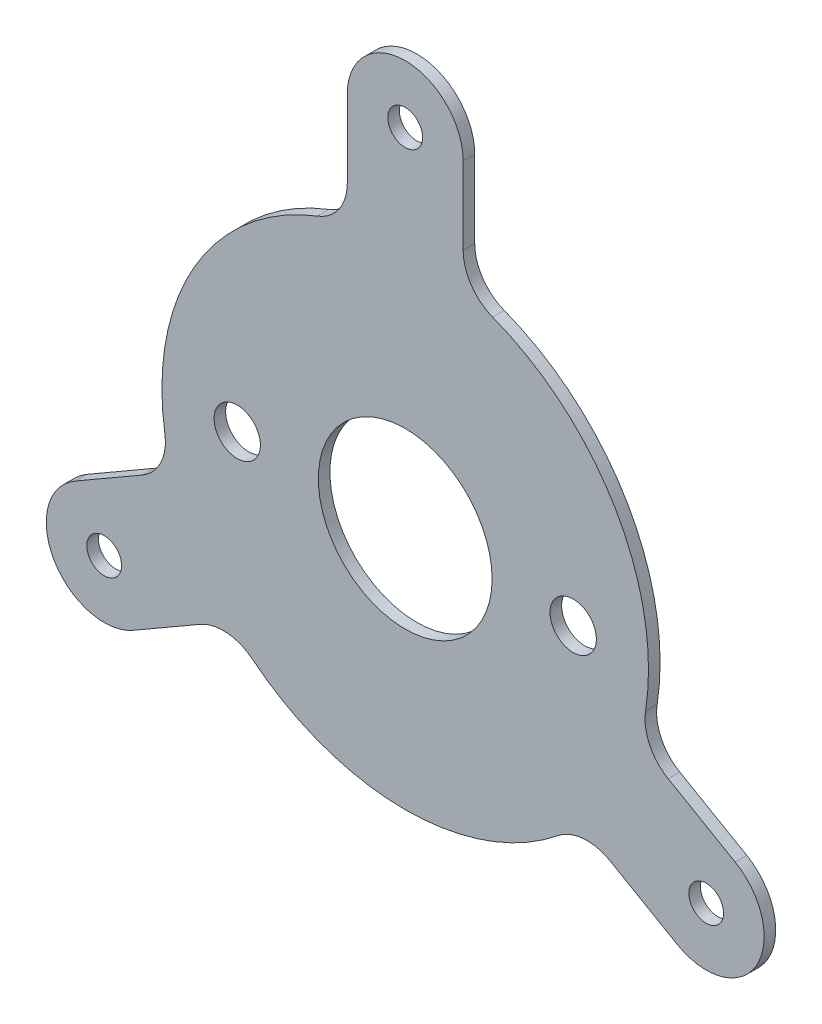
ISO-10303-21;
HEADER;
FILE_DESCRIPTION(('STEP AP214'),'2;1');
FILE_NAME('part.step','',(''),(''),'','','');
FILE_SCHEMA(('AUTOMOTIVE_DESIGN { 1 0 10303 214 1 1 1 1 }'));
ENDSEC;
DATA;
#1=APPLICATION_CONTEXT('core data for automotive mechanical design processes');
#2=APPLICATION_PROTOCOL_DEFINITION('international standard','automotive_design',2000,#1);
#3=PRODUCT_CONTEXT('',#1,'mechanical');
#4=PRODUCT('Part','Part','',(#3));
#5=PRODUCT_RELATED_PRODUCT_CATEGORY('part','',(#4));
#6=PRODUCT_DEFINITION_FORMATION('','',#4);
#7=PRODUCT_DEFINITION_CONTEXT('part definition',#1,'design');
#8=PRODUCT_DEFINITION('design','',#6,#7);
#9=PRODUCT_DEFINITION_SHAPE('','',#8);
#10=(LENGTH_UNIT() NAMED_UNIT(*) SI_UNIT(.MILLI.,.METRE.));
#11=(NAMED_UNIT(*) PLANE_ANGLE_UNIT() SI_UNIT($,.RADIAN.));
#12=(NAMED_UNIT(*) SI_UNIT($,.STERADIAN.) SOLID_ANGLE_UNIT());
#13=UNCERTAINTY_MEASURE_WITH_UNIT(LENGTH_MEASURE(1.E-05),#10,'distance_accuracy_value','');
#14=(GEOMETRIC_REPRESENTATION_CONTEXT(3) GLOBAL_UNCERTAINTY_ASSIGNED_CONTEXT((#13)) GLOBAL_UNIT_ASSIGNED_CONTEXT((#10,
#11,#12)) REPRESENTATION_CONTEXT('',''));
#15=CARTESIAN_POINT('',(0.,0.,0.));
#16=DIRECTION('',(0.,0.,1.));
#17=DIRECTION('',(1.,0.,0.));
#18=AXIS2_PLACEMENT_3D('',#15,#16,#17);
#19=CARTESIAN_POINT('',(0.,30.,1.));
#20=DIRECTION('',(0.,0.,-1.));
#21=DIRECTION('',(-1.,0.,0.));
#22=AXIS2_PLACEMENT_3D('',#19,#20,#21);
#23=PLANE('',#22);
#24=CARTESIAN_POINT('',(0.,30.,1.));
#25=DIRECTION('',(0.,0.,1.));
#26=DIRECTION('',(-1.,0.,0.));
#27=AXIS2_PLACEMENT_3D('',#24,#25,#26);
#28=CIRCLE('',#27,5.);
#29=CARTESIAN_POINT('',(5.,30.,1.));
#30=VERTEX_POINT('',#29);
#31=CARTESIAN_POINT('',(-5.,30.,1.));
#32=VERTEX_POINT('',#31);
#33=EDGE_CURVE('E147',#30,#32,#28,.T.);
#34=ORIENTED_EDGE('',*,*,#33,.T.);
#35=DIRECTION('',(0.,-1.,0.));
#36=VECTOR('',#35,1.);
#37=CARTESIAN_POINT('',(-5.,20.3960780543711,1.));
#38=LINE('',#37,#36);
#39=CARTESIAN_POINT('',(-5.,23.3238075793812,1.));
#40=VERTEX_POINT('',#39);
#41=EDGE_CURVE('E138',#32,#40,#38,.T.);
#42=ORIENTED_EDGE('',*,*,#41,.T.);
#43=CARTESIAN_POINT('',(-9.,23.3238075793812,1.));
#44=DIRECTION('',(0.,0.,-1.));
#45=DIRECTION('',(-1.,0.,0.));
#46=AXIS2_PLACEMENT_3D('',#43,#44,#45);
#47=CIRCLE('',#46,4.);
#48=CARTESIAN_POINT('',(-7.56,19.5919983666802,1.));
#49=VERTEX_POINT('',#48);
#50=EDGE_CURVE('E11',#40,#49,#47,.T.);
#51=ORIENTED_EDGE('',*,*,#50,.T.);
#52=CARTESIAN_POINT('',(0.,0.,1.));
#53=DIRECTION('',(0.,0.,1.));
#54=DIRECTION('',(1.,0.,0.));
#55=AXIS2_PLACEMENT_3D('',#52,#53,#54);
#56=CIRCLE('',#55,21.);
#57=CARTESIAN_POINT('',(-20.7471682964483,-3.24884713072979,1.));
#58=VERTEX_POINT('',#57);
#59=EDGE_CURVE('E146',#49,#58,#56,.T.);
#60=ORIENTED_EDGE('',*,*,#59,.T.);
#61=CARTESIAN_POINT('',(-24.6990098767242,-3.8676751556307,1.));
#62=DIRECTION('',(0.,0.,-1.));
#63=DIRECTION('',(-1.,0.,0.));
#64=AXIS2_PLACEMENT_3D('',#61,#62,#63);
#65=CIRCLE('',#64,4.);
#66=CARTESIAN_POINT('',(-22.6990098767241,-7.33177677076843,1.));
#67=VERTEX_POINT('',#66);
#68=EDGE_CURVE('E215',#58,#67,#65,.T.);
#69=ORIENTED_EDGE('',*,*,#68,.T.);
#70=DIRECTION('',(-0.866025403784431,-0.500000000000013,0.));
#71=VECTOR('',#70,1.);
#72=CARTESIAN_POINT('',(-20.1635217326557,-5.86791200826338,1.));
#73=LINE('',#72,#71);
#74=CARTESIAN_POINT('',(-28.4807621135331,-10.6698729810779,1.));
#75=VERTEX_POINT('',#74);
#76=EDGE_CURVE('E219',#67,#75,#73,.T.);
#77=ORIENTED_EDGE('',*,*,#76,.T.);
#78=CARTESIAN_POINT('',(-25.9807621135331,-15.,1.));
#79=DIRECTION('',(0.,0.,1.));
#80=DIRECTION('',(-1.,0.,0.));
#81=AXIS2_PLACEMENT_3D('',#78,#79,#80);
#82=CIRCLE('',#81,5.);
#83=CARTESIAN_POINT('',(-23.480762113533,-19.3301270189223,1.));
#84=VERTEX_POINT('',#83);
#85=EDGE_CURVE('E229',#75,#84,#82,.T.);
#86=ORIENTED_EDGE('',*,*,#85,.T.);
#87=DIRECTION('',(0.866025403784431,0.500000000000013,0.));
#88=VECTOR('',#87,1.);
#89=CARTESIAN_POINT('',(-15.1635217326557,-14.5281660461078,1.));
#90=LINE('',#89,#88);
#91=CARTESIAN_POINT('',(-17.6990098767242,-15.9920308086129,1.));
#92=VERTEX_POINT('',#91);
#93=EDGE_CURVE('E281',#84,#92,#90,.T.);
#94=ORIENTED_EDGE('',*,*,#93,.T.);
#95=CARTESIAN_POINT('',(-15.6990098767241,-19.4561324237506,1.));
#96=DIRECTION('',(0.,0.,-1.));
#97=DIRECTION('',(-1.,0.,0.));
#98=AXIS2_PLACEMENT_3D('',#95,#96,#97);
#99=CIRCLE('',#98,4.);
#100=CARTESIAN_POINT('',(-13.1871682964483,-16.3431512359505,1.));
#101=VERTEX_POINT('',#100);
#102=EDGE_CURVE('E211',#92,#101,#99,.T.);
#103=ORIENTED_EDGE('',*,*,#102,.T.);
#104=CARTESIAN_POINT('',(0.,0.,1.));
#105=DIRECTION('',(0.,0.,1.));
#106=DIRECTION('',(1.,0.,0.));
#107=AXIS2_PLACEMENT_3D('',#104,#105,#106);
#108=CIRCLE('',#107,21.);
#109=CARTESIAN_POINT('',(13.1871682964483,-16.3431512359505,1.));
#110=VERTEX_POINT('',#109);
#111=EDGE_CURVE('E293',#101,#110,#108,.T.);
#112=ORIENTED_EDGE('',*,*,#111,.T.);
#113=CARTESIAN_POINT('',(15.6990098767241,-19.4561324237506,1.));
#114=DIRECTION('',(0.,0.,-1.));
#115=DIRECTION('',(-1.,0.,0.));
#116=AXIS2_PLACEMENT_3D('',#113,#114,#115);
#117=CIRCLE('',#116,4.);
#118=CARTESIAN_POINT('',(17.6990098767242,-15.9920308086129,1.));
#119=VERTEX_POINT('',#118);
#120=EDGE_CURVE('E207',#110,#119,#117,.T.);
#121=ORIENTED_EDGE('',*,*,#120,.T.);
#122=DIRECTION('',(0.866025403784432,-0.500000000000012,0.));
#123=VECTOR('',#122,1.);
#124=CARTESIAN_POINT('',(15.1635217326557,-14.5281660461078,1.));
#125=LINE('',#124,#123);
#126=CARTESIAN_POINT('',(23.480762113533,-19.3301270189223,1.));
#127=VERTEX_POINT('',#126);
#128=EDGE_CURVE('E295',#119,#127,#125,.T.);
#129=ORIENTED_EDGE('',*,*,#128,.T.);
#130=CARTESIAN_POINT('',(25.9807621135331,-15.,1.));
#131=DIRECTION('',(0.,0.,1.));
#132=DIRECTION('',(-1.,0.,0.));
#133=AXIS2_PLACEMENT_3D('',#130,#131,#132);
#134=CIRCLE('',#133,5.);
#135=CARTESIAN_POINT('',(28.4807621135331,-10.6698729810779,1.));
#136=VERTEX_POINT('',#135);
#137=EDGE_CURVE('E297',#127,#136,#134,.T.);
#138=ORIENTED_EDGE('',*,*,#137,.T.);
#139=DIRECTION('',(-0.866025403784432,0.500000000000012,0.));
#140=VECTOR('',#139,1.);
#141=CARTESIAN_POINT('',(20.1635217326557,-5.86791200826338,1.));
#142=LINE('',#141,#140);
#143=CARTESIAN_POINT('',(22.6990098767241,-7.33177677076843,1.));
#144=VERTEX_POINT('',#143);
#145=EDGE_CURVE('E303',#136,#144,#142,.T.);
#146=ORIENTED_EDGE('',*,*,#145,.T.);
#147=CARTESIAN_POINT('',(24.6990098767242,-3.8676751556307,1.));
#148=DIRECTION('',(0.,0.,-1.));
#149=DIRECTION('',(-1.,0.,0.));
#150=AXIS2_PLACEMENT_3D('',#147,#148,#149);
#151=CIRCLE('',#150,4.);
#152=CARTESIAN_POINT('',(20.7471682964483,-3.24884713072979,1.));
#153=VERTEX_POINT('',#152);
#154=EDGE_CURVE('E203',#144,#153,#151,.T.);
#155=ORIENTED_EDGE('',*,*,#154,.T.);
#156=CARTESIAN_POINT('',(0.,0.,1.));
#157=DIRECTION('',(0.,0.,1.));
#158=DIRECTION('',(1.,0.,0.));
#159=AXIS2_PLACEMENT_3D('',#156,#157,#158);
#160=CIRCLE('',#159,21.);
#161=CARTESIAN_POINT('',(7.56,19.5919983666802,1.));
#162=VERTEX_POINT('',#161);
#163=EDGE_CURVE('E306',#153,#162,#160,.T.);
#164=ORIENTED_EDGE('',*,*,#163,.T.);
#165=CARTESIAN_POINT('',(9.,23.3238075793812,1.));
#166=DIRECTION('',(0.,0.,-1.));
#167=DIRECTION('',(-1.,0.,0.));
#168=AXIS2_PLACEMENT_3D('',#165,#166,#167);
#169=CIRCLE('',#168,4.);
#170=CARTESIAN_POINT('',(5.,23.3238075793812,1.));
#171=VERTEX_POINT('',#170);
#172=EDGE_CURVE('E199',#162,#171,#169,.T.);
#173=ORIENTED_EDGE('',*,*,#172,.T.);
#174=DIRECTION('',(0.,1.,0.));
#175=VECTOR('',#174,1.);
#176=CARTESIAN_POINT('',(5.,20.3960780543711,1.));
#177=LINE('',#176,#175);
#178=EDGE_CURVE('E152',#171,#30,#177,.T.);
#179=ORIENTED_EDGE('',*,*,#178,.T.);
#180=EDGE_LOOP('',(#34,#42,#51,#60,#69,#77,#86,#94,#103,#112,#121,#129,#138,#146,#155,#164,#173,#179));
#181=FACE_BOUND('',#180,.T.);
#182=CARTESIAN_POINT('',(0.,30.,1.));
#183=DIRECTION('',(0.,0.,1.));
#184=DIRECTION('',(1.,0.,0.));
#185=AXIS2_PLACEMENT_3D('',#182,#183,#184);
#186=CIRCLE('',#185,1.5);
#187=CARTESIAN_POINT('',(1.5,30.,1.));
#188=VERTEX_POINT('',#187);
#189=EDGE_CURVE('E309',#188,#188,#186,.T.);
#190=ORIENTED_EDGE('',*,*,#189,.F.);
#191=EDGE_LOOP('',(#190));
#192=FACE_BOUND('',#191,.T.);
#193=CARTESIAN_POINT('',(25.9807621135331,-15.,1.));
#194=DIRECTION('',(0.,0.,1.));
#195=DIRECTION('',(1.,0.,0.));
#196=AXIS2_PLACEMENT_3D('',#193,#194,#195);
#197=CIRCLE('',#196,1.5);
#198=CARTESIAN_POINT('',(27.4807621135331,-15.,1.));
#199=VERTEX_POINT('',#198);
#200=EDGE_CURVE('E316',#199,#199,#197,.T.);
#201=ORIENTED_EDGE('',*,*,#200,.F.);
#202=EDGE_LOOP('',(#201));
#203=FACE_BOUND('',#202,.T.);
#204=CARTESIAN_POINT('',(-25.9807621135331,-15.,1.));
#205=DIRECTION('',(0.,0.,1.));
#206=DIRECTION('',(1.,0.,0.));
#207=AXIS2_PLACEMENT_3D('',#204,#205,#206);
#208=CIRCLE('',#207,1.5);
#209=CARTESIAN_POINT('',(-24.4807621135331,-15.,1.));
#210=VERTEX_POINT('',#209);
#211=EDGE_CURVE('E608',#210,#210,#208,.T.);
#212=ORIENTED_EDGE('',*,*,#211,.F.);
#213=EDGE_LOOP('',(#212));
#214=FACE_BOUND('',#213,.T.);
#215=CARTESIAN_POINT('',(0.,0.,1.));
#216=DIRECTION('',(0.,0.,1.));
#217=DIRECTION('',(1.,0.,0.));
#218=AXIS2_PLACEMENT_3D('',#215,#216,#217);
#219=CIRCLE('',#218,7.5);
#220=CARTESIAN_POINT('',(7.5,0.,1.));
#221=VERTEX_POINT('',#220);
#222=EDGE_CURVE('E602',#221,#221,#219,.T.);
#223=ORIENTED_EDGE('',*,*,#222,.F.);
#224=EDGE_LOOP('',(#223));
#225=FACE_BOUND('',#224,.T.);
#226=CARTESIAN_POINT('',(14.5,0.,1.));
#227=DIRECTION('',(0.,0.,1.));
#228=DIRECTION('',(1.,0.,0.));
#229=AXIS2_PLACEMENT_3D('',#226,#227,#228);
#230=CIRCLE('',#229,2.);
#231=CARTESIAN_POINT('',(16.5,0.,1.));
#232=VERTEX_POINT('',#231);
#233=EDGE_CURVE('E596',#232,#232,#230,.T.);
#234=ORIENTED_EDGE('',*,*,#233,.F.);
#235=EDGE_LOOP('',(#234));
#236=FACE_BOUND('',#235,.T.);
#237=CARTESIAN_POINT('',(-14.5,0.,1.));
#238=DIRECTION('',(0.,0.,1.));
#239=DIRECTION('',(1.,0.,0.));
#240=AXIS2_PLACEMENT_3D('',#237,#238,#239);
#241=CIRCLE('',#240,2.);
#242=CARTESIAN_POINT('',(-12.5,0.,1.));
#243=VERTEX_POINT('',#242);
#244=EDGE_CURVE('E587',#243,#243,#241,.T.);
#245=ORIENTED_EDGE('',*,*,#244,.F.);
#246=EDGE_LOOP('',(#245));
#247=FACE_BOUND('',#246,.T.);
#248=ADVANCED_FACE('F17',(#181,#192,#203,#214,#225,#236,#247),#23,.F.);
#249=CARTESIAN_POINT('',(0.,30.,0.));
#250=DIRECTION('',(0.,0.,-1.));
#251=DIRECTION('',(-1.,0.,0.));
#252=AXIS2_PLACEMENT_3D('',#249,#250,#251);
#253=PLANE('',#252);
#254=CARTESIAN_POINT('',(14.5,0.,0.));
#255=DIRECTION('',(0.,0.,1.));
#256=DIRECTION('',(1.,0.,0.));
#257=AXIS2_PLACEMENT_3D('',#254,#255,#256);
#258=CIRCLE('',#257,2.);
#259=CARTESIAN_POINT('',(16.5,0.,0.));
#260=VERTEX_POINT('',#259);
#261=EDGE_CURVE('E593',#260,#260,#258,.T.);
#262=ORIENTED_EDGE('',*,*,#261,.T.);
#263=EDGE_LOOP('',(#262));
#264=FACE_BOUND('',#263,.T.);
#265=CARTESIAN_POINT('',(-25.9807621135331,-15.,0.));
#266=DIRECTION('',(0.,0.,1.));
#267=DIRECTION('',(1.,0.,0.));
#268=AXIS2_PLACEMENT_3D('',#265,#266,#267);
#269=CIRCLE('',#268,1.5);
#270=CARTESIAN_POINT('',(-24.4807621135331,-15.,0.));
#271=VERTEX_POINT('',#270);
#272=EDGE_CURVE('E605',#271,#271,#269,.T.);
#273=ORIENTED_EDGE('',*,*,#272,.T.);
#274=EDGE_LOOP('',(#273));
#275=FACE_BOUND('',#274,.T.);
#276=CARTESIAN_POINT('',(0.,30.,0.));
#277=DIRECTION('',(0.,0.,1.));
#278=DIRECTION('',(1.,0.,0.));
#279=AXIS2_PLACEMENT_3D('',#276,#277,#278);
#280=CIRCLE('',#279,1.5);
#281=CARTESIAN_POINT('',(1.5,30.,0.));
#282=VERTEX_POINT('',#281);
#283=EDGE_CURVE('E311',#282,#282,#280,.T.);
#284=ORIENTED_EDGE('',*,*,#283,.T.);
#285=EDGE_LOOP('',(#284));
#286=FACE_BOUND('',#285,.T.);
#287=CARTESIAN_POINT('',(0.,30.,0.));
#288=DIRECTION('',(0.,0.,1.));
#289=DIRECTION('',(-1.,0.,0.));
#290=AXIS2_PLACEMENT_3D('',#287,#288,#289);
#291=CIRCLE('',#290,5.);
#292=CARTESIAN_POINT('',(5.,30.,0.));
#293=VERTEX_POINT('',#292);
#294=CARTESIAN_POINT('',(-5.,30.,0.));
#295=VERTEX_POINT('',#294);
#296=EDGE_CURVE('E160',#293,#295,#291,.T.);
#297=ORIENTED_EDGE('',*,*,#296,.F.);
#298=DIRECTION('',(0.,1.,0.));
#299=VECTOR('',#298,1.);
#300=CARTESIAN_POINT('',(5.,20.3960780543711,0.));
#301=LINE('',#300,#299);
#302=CARTESIAN_POINT('',(5.,23.3238075793812,0.));
#303=VERTEX_POINT('',#302);
#304=EDGE_CURVE('E156',#303,#293,#301,.T.);
#305=ORIENTED_EDGE('',*,*,#304,.F.);
#306=CARTESIAN_POINT('',(9.,23.3238075793812,0.));
#307=DIRECTION('',(0.,0.,-1.));
#308=DIRECTION('',(-1.,0.,0.));
#309=AXIS2_PLACEMENT_3D('',#306,#307,#308);
#310=CIRCLE('',#309,4.);
#311=CARTESIAN_POINT('',(7.56,19.5919983666802,0.));
#312=VERTEX_POINT('',#311);
#313=EDGE_CURVE('E197',#303,#312,#310,.F.);
#314=ORIENTED_EDGE('',*,*,#313,.T.);
#315=CARTESIAN_POINT('',(0.,0.,0.));
#316=DIRECTION('',(0.,0.,1.));
#317=DIRECTION('',(1.,0.,0.));
#318=AXIS2_PLACEMENT_3D('',#315,#316,#317);
#319=CIRCLE('',#318,21.);
#320=CARTESIAN_POINT('',(20.7471682964483,-3.24884713072979,0.));
#321=VERTEX_POINT('',#320);
#322=EDGE_CURVE('E262',#321,#312,#319,.T.);
#323=ORIENTED_EDGE('',*,*,#322,.F.);
#324=CARTESIAN_POINT('',(24.6990098767242,-3.8676751556307,0.));
#325=DIRECTION('',(0.,0.,-1.));
#326=DIRECTION('',(-1.,0.,0.));
#327=AXIS2_PLACEMENT_3D('',#324,#325,#326);
#328=CIRCLE('',#327,4.);
#329=CARTESIAN_POINT('',(22.6990098767241,-7.33177677076843,0.));
#330=VERTEX_POINT('',#329);
#331=EDGE_CURVE('E201',#321,#330,#328,.F.);
#332=ORIENTED_EDGE('',*,*,#331,.T.);
#333=DIRECTION('',(-0.866025403784432,0.500000000000012,0.));
#334=VECTOR('',#333,1.);
#335=CARTESIAN_POINT('',(20.1635217326557,-5.86791200826338,0.));
#336=LINE('',#335,#334);
#337=CARTESIAN_POINT('',(28.4807621135331,-10.6698729810779,0.));
#338=VERTEX_POINT('',#337);
#339=EDGE_CURVE('E259',#338,#330,#336,.T.);
#340=ORIENTED_EDGE('',*,*,#339,.F.);
#341=CARTESIAN_POINT('',(25.9807621135331,-15.,0.));
#342=DIRECTION('',(0.,0.,1.));
#343=DIRECTION('',(-1.,0.,0.));
#344=AXIS2_PLACEMENT_3D('',#341,#342,#343);
#345=CIRCLE('',#344,5.);
#346=CARTESIAN_POINT('',(23.480762113533,-19.3301270189223,0.));
#347=VERTEX_POINT('',#346);
#348=EDGE_CURVE('E257',#347,#338,#345,.T.);
#349=ORIENTED_EDGE('',*,*,#348,.F.);
#350=DIRECTION('',(0.866025403784432,-0.500000000000012,0.));
#351=VECTOR('',#350,1.);
#352=CARTESIAN_POINT('',(15.1635217326557,-14.5281660461078,0.));
#353=LINE('',#352,#351);
#354=CARTESIAN_POINT('',(17.6990098767242,-15.9920308086129,0.));
#355=VERTEX_POINT('',#354);
#356=EDGE_CURVE('E255',#355,#347,#353,.T.);
#357=ORIENTED_EDGE('',*,*,#356,.F.);
#358=CARTESIAN_POINT('',(15.6990098767241,-19.4561324237506,0.));
#359=DIRECTION('',(0.,0.,-1.));
#360=DIRECTION('',(-1.,0.,0.));
#361=AXIS2_PLACEMENT_3D('',#358,#359,#360);
#362=CIRCLE('',#361,4.);
#363=CARTESIAN_POINT('',(13.1871682964483,-16.3431512359505,0.));
#364=VERTEX_POINT('',#363);
#365=EDGE_CURVE('E205',#355,#364,#362,.F.);
#366=ORIENTED_EDGE('',*,*,#365,.T.);
#367=CARTESIAN_POINT('',(0.,0.,0.));
#368=DIRECTION('',(0.,0.,1.));
#369=DIRECTION('',(1.,0.,0.));
#370=AXIS2_PLACEMENT_3D('',#367,#368,#369);
#371=CIRCLE('',#370,21.);
#372=CARTESIAN_POINT('',(-13.1871682964483,-16.3431512359505,0.));
#373=VERTEX_POINT('',#372);
#374=EDGE_CURVE('E252',#373,#364,#371,.T.);
#375=ORIENTED_EDGE('',*,*,#374,.F.);
#376=CARTESIAN_POINT('',(-15.6990098767241,-19.4561324237506,0.));
#377=DIRECTION('',(0.,0.,-1.));
#378=DIRECTION('',(-1.,0.,0.));
#379=AXIS2_PLACEMENT_3D('',#376,#377,#378);
#380=CIRCLE('',#379,4.);
#381=CARTESIAN_POINT('',(-17.6990098767242,-15.9920308086129,0.));
#382=VERTEX_POINT('',#381);
#383=EDGE_CURVE('E209',#373,#382,#380,.F.);
#384=ORIENTED_EDGE('',*,*,#383,.T.);
#385=DIRECTION('',(0.866025403784431,0.500000000000013,0.));
#386=VECTOR('',#385,1.);
#387=CARTESIAN_POINT('',(-15.1635217326557,-14.5281660461078,0.));
#388=LINE('',#387,#386);
#389=CARTESIAN_POINT('',(-23.480762113533,-19.3301270189223,0.));
#390=VERTEX_POINT('',#389);
#391=EDGE_CURVE('E249',#390,#382,#388,.T.);
#392=ORIENTED_EDGE('',*,*,#391,.F.);
#393=CARTESIAN_POINT('',(-25.9807621135331,-15.,0.));
#394=DIRECTION('',(0.,0.,1.));
#395=DIRECTION('',(-1.,0.,0.));
#396=AXIS2_PLACEMENT_3D('',#393,#394,#395);
#397=CIRCLE('',#396,5.);
#398=CARTESIAN_POINT('',(-28.4807621135331,-10.6698729810779,0.));
#399=VERTEX_POINT('',#398);
#400=EDGE_CURVE('E243',#399,#390,#397,.T.);
#401=ORIENTED_EDGE('',*,*,#400,.F.);
#402=DIRECTION('',(-0.866025403784431,-0.500000000000013,0.));
#403=VECTOR('',#402,1.);
#404=CARTESIAN_POINT('',(-20.1635217326557,-5.86791200826338,0.));
#405=LINE('',#404,#403);
#406=CARTESIAN_POINT('',(-22.6990098767241,-7.33177677076843,0.));
#407=VERTEX_POINT('',#406);
#408=EDGE_CURVE('E237',#407,#399,#405,.T.);
#409=ORIENTED_EDGE('',*,*,#408,.F.);
#410=CARTESIAN_POINT('',(-24.6990098767242,-3.8676751556307,0.));
#411=DIRECTION('',(0.,0.,-1.));
#412=DIRECTION('',(-1.,0.,0.));
#413=AXIS2_PLACEMENT_3D('',#410,#411,#412);
#414=CIRCLE('',#413,4.);
#415=CARTESIAN_POINT('',(-20.7471682964483,-3.24884713072979,0.));
#416=VERTEX_POINT('',#415);
#417=EDGE_CURVE('E213',#407,#416,#414,.F.);
#418=ORIENTED_EDGE('',*,*,#417,.T.);
#419=CARTESIAN_POINT('',(0.,0.,0.));
#420=DIRECTION('',(0.,0.,1.));
#421=DIRECTION('',(1.,0.,0.));
#422=AXIS2_PLACEMENT_3D('',#419,#420,#421);
#423=CIRCLE('',#422,21.);
#424=CARTESIAN_POINT('',(-7.56,19.5919983666802,0.));
#425=VERTEX_POINT('',#424);
#426=EDGE_CURVE('E235',#425,#416,#423,.T.);
#427=ORIENTED_EDGE('',*,*,#426,.F.);
#428=CARTESIAN_POINT('',(-9.,23.3238075793812,0.));
#429=DIRECTION('',(0.,0.,-1.));
#430=DIRECTION('',(-1.,0.,0.));
#431=AXIS2_PLACEMENT_3D('',#428,#429,#430);
#432=CIRCLE('',#431,4.);
#433=CARTESIAN_POINT('',(-5.,23.3238075793812,0.));
#434=VERTEX_POINT('',#433);
#435=EDGE_CURVE('E25',#425,#434,#432,.F.);
#436=ORIENTED_EDGE('',*,*,#435,.T.);
#437=DIRECTION('',(0.,-1.,0.));
#438=VECTOR('',#437,1.);
#439=CARTESIAN_POINT('',(-5.,20.3960780543711,0.));
#440=LINE('',#439,#438);
#441=EDGE_CURVE('E241',#295,#434,#440,.T.);
#442=ORIENTED_EDGE('',*,*,#441,.F.);
#443=EDGE_LOOP('',(#297,#305,#314,#323,#332,#340,#349,#357,#366,#375,#384,#392,#401,#409,#418,
#427,#436,#442));
#444=FACE_BOUND('',#443,.T.);
#445=CARTESIAN_POINT('',(25.9807621135331,-15.,0.));
#446=DIRECTION('',(0.,0.,1.));
#447=DIRECTION('',(1.,0.,0.));
#448=AXIS2_PLACEMENT_3D('',#445,#446,#447);
#449=CIRCLE('',#448,1.5);
#450=CARTESIAN_POINT('',(27.4807621135331,-15.,0.));
#451=VERTEX_POINT('',#450);
#452=EDGE_CURVE('E319',#451,#451,#449,.T.);
#453=ORIENTED_EDGE('',*,*,#452,.T.);
#454=EDGE_LOOP('',(#453));
#455=FACE_BOUND('',#454,.T.);
#456=CARTESIAN_POINT('',(0.,0.,0.));
#457=DIRECTION('',(0.,0.,1.));
#458=DIRECTION('',(1.,0.,0.));
#459=AXIS2_PLACEMENT_3D('',#456,#457,#458);
#460=CIRCLE('',#459,7.5);
#461=CARTESIAN_POINT('',(7.5,0.,0.));
#462=VERTEX_POINT('',#461);
#463=EDGE_CURVE('E599',#462,#462,#460,.T.);
#464=ORIENTED_EDGE('',*,*,#463,.T.);
#465=EDGE_LOOP('',(#464));
#466=FACE_BOUND('',#465,.T.);
#467=CARTESIAN_POINT('',(-14.5,0.,0.));
#468=DIRECTION('',(0.,0.,1.));
#469=DIRECTION('',(1.,0.,0.));
#470=AXIS2_PLACEMENT_3D('',#467,#468,#469);
#471=CIRCLE('',#470,2.);
#472=CARTESIAN_POINT('',(-12.5,0.,0.));
#473=VERTEX_POINT('',#472);
#474=EDGE_CURVE('E590',#473,#473,#471,.T.);
#475=ORIENTED_EDGE('',*,*,#474,.T.);
#476=EDGE_LOOP('',(#475));
#477=FACE_BOUND('',#476,.T.);
#478=ADVANCED_FACE('F233',(#264,#275,#286,#444,#455,#466,#477),#253,.T.);
#479=CARTESIAN_POINT('',(0.,30.,1.));
#480=DIRECTION('',(0.,0.,-1.));
#481=DIRECTION('',(-1.,0.,0.));
#482=AXIS2_PLACEMENT_3D('',#479,#480,#481);
#483=CYLINDRICAL_SURFACE('',#482,5.);
#484=ORIENTED_EDGE('',*,*,#296,.T.);
#485=DIRECTION('',(0.,0.,-1.));
#486=VECTOR('',#485,1.);
#487=CARTESIAN_POINT('',(-5.,30.,1.));
#488=LINE('',#487,#486);
#489=EDGE_CURVE('E142',#32,#295,#488,.T.);
#490=ORIENTED_EDGE('',*,*,#489,.F.);
#491=ORIENTED_EDGE('',*,*,#33,.F.);
#492=DIRECTION('',(0.,0.,-1.));
#493=VECTOR('',#492,1.);
#494=CARTESIAN_POINT('',(5.,30.,1.));
#495=LINE('',#494,#493);
#496=EDGE_CURVE('E266',#30,#293,#495,.T.);
#497=ORIENTED_EDGE('',*,*,#496,.T.);
#498=EDGE_LOOP('',(#484,#490,#491,#497));
#499=FACE_BOUND('',#498,.T.);
#500=ADVANCED_FACE('F158',(#499),#483,.T.);
#501=CARTESIAN_POINT('',(-5.,20.3960780543711,1.));
#502=DIRECTION('',(1.,0.,0.));
#503=DIRECTION('',(0.,0.,-1.));
#504=AXIS2_PLACEMENT_3D('',#501,#502,#503);
#505=PLANE('',#504);
#506=ORIENTED_EDGE('',*,*,#441,.T.);
#507=DIRECTION('',(0.,0.,1.));
#508=VECTOR('',#507,1.);
#509=CARTESIAN_POINT('',(-5.,23.3238075793812,1.));
#510=LINE('',#509,#508);
#511=EDGE_CURVE('E32',#434,#40,#510,.T.);
#512=ORIENTED_EDGE('',*,*,#511,.T.);
#513=ORIENTED_EDGE('',*,*,#41,.F.);
#514=ORIENTED_EDGE('',*,*,#489,.T.);
#515=EDGE_LOOP('',(#506,#512,#513,#514));
#516=FACE_BOUND('',#515,.T.);
#517=ADVANCED_FACE('F140',(#516),#505,.F.);
#518=CARTESIAN_POINT('',(0.,0.,1.));
#519=DIRECTION('',(0.,0.,-1.));
#520=DIRECTION('',(-1.,0.,0.));
#521=AXIS2_PLACEMENT_3D('',#518,#519,#520);
#522=CYLINDRICAL_SURFACE('',#521,21.);
#523=ORIENTED_EDGE('',*,*,#426,.T.);
#524=DIRECTION('',(0.,0.,-1.));
#525=VECTOR('',#524,1.);
#526=CARTESIAN_POINT('',(-20.7471682964483,-3.24884713072979,1.));
#527=LINE('',#526,#525);
#528=EDGE_CURVE('E194',#416,#58,#527,.F.);
#529=ORIENTED_EDGE('',*,*,#528,.T.);
#530=ORIENTED_EDGE('',*,*,#59,.F.);
#531=DIRECTION('',(0.,0.,-1.));
#532=VECTOR('',#531,1.);
#533=CARTESIAN_POINT('',(-7.56,19.5919983666802,1.));
#534=LINE('',#533,#532);
#535=EDGE_CURVE('E191',#49,#425,#534,.T.);
#536=ORIENTED_EDGE('',*,*,#535,.T.);
#537=EDGE_LOOP('',(#523,#529,#530,#536));
#538=FACE_BOUND('',#537,.T.);
#539=ADVANCED_FACE('F239',(#538),#522,.T.);
#540=CARTESIAN_POINT('',(-20.1635217326557,-5.86791200826338,1.));
#541=DIRECTION('',(0.500000000000013,-0.866025403784431,0.));
#542=DIRECTION('',(0.866025403784431,0.500000000000013,0.));
#543=AXIS2_PLACEMENT_3D('',#540,#541,#542);
#544=PLANE('',#543);
#545=ORIENTED_EDGE('',*,*,#76,.F.);
#546=DIRECTION('',(0.,0.,1.));
#547=VECTOR('',#546,1.);
#548=CARTESIAN_POINT('',(-22.6990098767241,-7.33177677076843,0.));
#549=LINE('',#548,#547);
#550=EDGE_CURVE('E188',#67,#407,#549,.F.);
#551=ORIENTED_EDGE('',*,*,#550,.T.);
#552=ORIENTED_EDGE('',*,*,#408,.T.);
#553=DIRECTION('',(0.,0.,-1.));
#554=VECTOR('',#553,1.);
#555=CARTESIAN_POINT('',(-28.4807621135331,-10.6698729810779,1.));
#556=LINE('',#555,#554);
#557=EDGE_CURVE('E162',#75,#399,#556,.T.);
#558=ORIENTED_EDGE('',*,*,#557,.F.);
#559=EDGE_LOOP('',(#545,#551,#552,#558));
#560=FACE_BOUND('',#559,.T.);
#561=ADVANCED_FACE('F226',(#560),#544,.F.);
#562=CARTESIAN_POINT('',(-25.9807621135331,-15.,1.));
#563=DIRECTION('',(0.,0.,-1.));
#564=DIRECTION('',(-1.,0.,0.));
#565=AXIS2_PLACEMENT_3D('',#562,#563,#564);
#566=CYLINDRICAL_SURFACE('',#565,5.);
#567=ORIENTED_EDGE('',*,*,#400,.T.);
#568=DIRECTION('',(0.,0.,-1.));
#569=VECTOR('',#568,1.);
#570=CARTESIAN_POINT('',(-23.480762113533,-19.3301270189223,1.));
#571=LINE('',#570,#569);
#572=EDGE_CURVE('E168',#84,#390,#571,.T.);
#573=ORIENTED_EDGE('',*,*,#572,.F.);
#574=ORIENTED_EDGE('',*,*,#85,.F.);
#575=ORIENTED_EDGE('',*,*,#557,.T.);
#576=EDGE_LOOP('',(#567,#573,#574,#575));
#577=FACE_BOUND('',#576,.T.);
#578=ADVANCED_FACE('F322',(#577),#566,.T.);
#579=CARTESIAN_POINT('',(-15.1635217326557,-14.5281660461078,1.));
#580=DIRECTION('',(-0.500000000000013,0.866025403784431,0.));
#581=DIRECTION('',(-0.866025403784431,-0.500000000000013,0.));
#582=AXIS2_PLACEMENT_3D('',#579,#580,#581);
#583=PLANE('',#582);
#584=ORIENTED_EDGE('',*,*,#391,.T.);
#585=DIRECTION('',(0.,0.,1.));
#586=VECTOR('',#585,1.);
#587=CARTESIAN_POINT('',(-17.6990098767242,-15.9920308086129,1.));
#588=LINE('',#587,#586);
#589=EDGE_CURVE('E186',#382,#92,#588,.T.);
#590=ORIENTED_EDGE('',*,*,#589,.T.);
#591=ORIENTED_EDGE('',*,*,#93,.F.);
#592=ORIENTED_EDGE('',*,*,#572,.T.);
#593=EDGE_LOOP('',(#584,#590,#591,#592));
#594=FACE_BOUND('',#593,.T.);
#595=ADVANCED_FACE('F278',(#594),#583,.F.);
#596=CARTESIAN_POINT('',(0.,0.,1.));
#597=DIRECTION('',(0.,0.,-1.));
#598=DIRECTION('',(-1.,0.,0.));
#599=AXIS2_PLACEMENT_3D('',#596,#597,#598);
#600=CYLINDRICAL_SURFACE('',#599,21.);
#601=ORIENTED_EDGE('',*,*,#374,.T.);
#602=DIRECTION('',(0.,0.,-1.));
#603=VECTOR('',#602,1.);
#604=CARTESIAN_POINT('',(13.1871682964483,-16.3431512359505,1.));
#605=LINE('',#604,#603);
#606=EDGE_CURVE('E184',#364,#110,#605,.F.);
#607=ORIENTED_EDGE('',*,*,#606,.T.);
#608=ORIENTED_EDGE('',*,*,#111,.F.);
#609=DIRECTION('',(0.,0.,-1.));
#610=VECTOR('',#609,1.);
#611=CARTESIAN_POINT('',(-13.1871682964483,-16.3431512359505,1.));
#612=LINE('',#611,#610);
#613=EDGE_CURVE('E181',#101,#373,#612,.T.);
#614=ORIENTED_EDGE('',*,*,#613,.T.);
#615=EDGE_LOOP('',(#601,#607,#608,#614));
#616=FACE_BOUND('',#615,.T.);
#617=ADVANCED_FACE('F290',(#616),#600,.T.);
#618=CARTESIAN_POINT('',(15.1635217326557,-14.5281660461078,1.));
#619=DIRECTION('',(0.500000000000012,0.866025403784432,0.));
#620=DIRECTION('',(-0.866025403784432,0.500000000000012,0.));
#621=AXIS2_PLACEMENT_3D('',#618,#619,#620);
#622=PLANE('',#621);
#623=ORIENTED_EDGE('',*,*,#128,.F.);
#624=DIRECTION('',(0.,0.,1.));
#625=VECTOR('',#624,1.);
#626=CARTESIAN_POINT('',(17.6990098767242,-15.9920308086129,0.));
#627=LINE('',#626,#625);
#628=EDGE_CURVE('E178',#119,#355,#627,.F.);
#629=ORIENTED_EDGE('',*,*,#628,.T.);
#630=ORIENTED_EDGE('',*,*,#356,.T.);
#631=DIRECTION('',(0.,0.,-1.));
#632=VECTOR('',#631,1.);
#633=CARTESIAN_POINT('',(23.480762113533,-19.3301270189223,1.));
#634=LINE('',#633,#632);
#635=EDGE_CURVE('E271',#127,#347,#634,.T.);
#636=ORIENTED_EDGE('',*,*,#635,.F.);
#637=EDGE_LOOP('',(#623,#629,#630,#636));
#638=FACE_BOUND('',#637,.T.);
#639=ADVANCED_FACE('F360',(#638),#622,.F.);
#640=CARTESIAN_POINT('',(25.9807621135331,-15.,1.));
#641=DIRECTION('',(0.,0.,-1.));
#642=DIRECTION('',(-1.,0.,0.));
#643=AXIS2_PLACEMENT_3D('',#640,#641,#642);
#644=CYLINDRICAL_SURFACE('',#643,5.);
#645=ORIENTED_EDGE('',*,*,#348,.T.);
#646=DIRECTION('',(0.,0.,-1.));
#647=VECTOR('',#646,1.);
#648=CARTESIAN_POINT('',(28.4807621135331,-10.6698729810779,1.));
#649=LINE('',#648,#647);
#650=EDGE_CURVE('E268',#136,#338,#649,.T.);
#651=ORIENTED_EDGE('',*,*,#650,.F.);
#652=ORIENTED_EDGE('',*,*,#137,.F.);
#653=ORIENTED_EDGE('',*,*,#635,.T.);
#654=EDGE_LOOP('',(#645,#651,#652,#653));
#655=FACE_BOUND('',#654,.T.);
#656=ADVANCED_FACE('F356',(#655),#644,.T.);
#657=CARTESIAN_POINT('',(20.1635217326557,-5.86791200826338,1.));
#658=DIRECTION('',(-0.500000000000012,-0.866025403784432,0.));
#659=DIRECTION('',(0.866025403784432,-0.500000000000012,0.));
#660=AXIS2_PLACEMENT_3D('',#657,#658,#659);
#661=PLANE('',#660);
#662=ORIENTED_EDGE('',*,*,#339,.T.);
#663=DIRECTION('',(0.,0.,1.));
#664=VECTOR('',#663,1.);
#665=CARTESIAN_POINT('',(22.6990098767241,-7.33177677076843,1.));
#666=LINE('',#665,#664);
#667=EDGE_CURVE('E176',#330,#144,#666,.T.);
#668=ORIENTED_EDGE('',*,*,#667,.T.);
#669=ORIENTED_EDGE('',*,*,#145,.F.);
#670=ORIENTED_EDGE('',*,*,#650,.T.);
#671=EDGE_LOOP('',(#662,#668,#669,#670));
#672=FACE_BOUND('',#671,.T.);
#673=ADVANCED_FACE('F352',(#672),#661,.F.);
#674=CARTESIAN_POINT('',(0.,0.,1.));
#675=DIRECTION('',(0.,0.,-1.));
#676=DIRECTION('',(-1.,0.,0.));
#677=AXIS2_PLACEMENT_3D('',#674,#675,#676);
#678=CYLINDRICAL_SURFACE('',#677,21.);
#679=ORIENTED_EDGE('',*,*,#322,.T.);
#680=DIRECTION('',(0.,0.,-1.));
#681=VECTOR('',#680,1.);
#682=CARTESIAN_POINT('',(7.56,19.5919983666802,1.));
#683=LINE('',#682,#681);
#684=EDGE_CURVE('E174',#312,#162,#683,.F.);
#685=ORIENTED_EDGE('',*,*,#684,.T.);
#686=ORIENTED_EDGE('',*,*,#163,.F.);
#687=DIRECTION('',(0.,0.,-1.));
#688=VECTOR('',#687,1.);
#689=CARTESIAN_POINT('',(20.7471682964483,-3.24884713072979,1.));
#690=LINE('',#689,#688);
#691=EDGE_CURVE('E165',#153,#321,#690,.T.);
#692=ORIENTED_EDGE('',*,*,#691,.T.);
#693=EDGE_LOOP('',(#679,#685,#686,#692));
#694=FACE_BOUND('',#693,.T.);
#695=ADVANCED_FACE('F348',(#694),#678,.T.);
#696=CARTESIAN_POINT('',(5.,20.3960780543711,1.));
#697=DIRECTION('',(-1.,0.,0.));
#698=DIRECTION('',(0.,0.,1.));
#699=AXIS2_PLACEMENT_3D('',#696,#697,#698);
#700=PLANE('',#699);
#701=ORIENTED_EDGE('',*,*,#178,.F.);
#702=DIRECTION('',(0.,0.,1.));
#703=VECTOR('',#702,1.);
#704=CARTESIAN_POINT('',(5.,23.3238075793812,0.));
#705=LINE('',#704,#703);
#706=EDGE_CURVE('E161',#171,#303,#705,.F.);
#707=ORIENTED_EDGE('',*,*,#706,.T.);
#708=ORIENTED_EDGE('',*,*,#304,.T.);
#709=ORIENTED_EDGE('',*,*,#496,.F.);
#710=EDGE_LOOP('',(#701,#707,#708,#709));
#711=FACE_BOUND('',#710,.T.);
#712=ADVANCED_FACE('F345',(#711),#700,.F.);
#713=CARTESIAN_POINT('',(0.,30.,1.));
#714=DIRECTION('',(0.,0.,-1.));
#715=DIRECTION('',(-1.,0.,0.));
#716=AXIS2_PLACEMENT_3D('',#713,#714,#715);
#717=CYLINDRICAL_SURFACE('',#716,1.5);
#718=ORIENTED_EDGE('',*,*,#189,.T.);
#719=EDGE_LOOP('',(#718));
#720=FACE_BOUND('',#719,.T.);
#721=ORIENTED_EDGE('',*,*,#283,.F.);
#722=EDGE_LOOP('',(#721));
#723=FACE_BOUND('',#722,.T.);
#724=ADVANCED_FACE('F342',(#720,#723),#717,.F.);
#725=CARTESIAN_POINT('',(25.9807621135331,-15.,1.));
#726=DIRECTION('',(0.,0.,-1.));
#727=DIRECTION('',(-1.,0.,0.));
#728=AXIS2_PLACEMENT_3D('',#725,#726,#727);
#729=CYLINDRICAL_SURFACE('',#728,1.5);
#730=ORIENTED_EDGE('',*,*,#200,.T.);
#731=EDGE_LOOP('',(#730));
#732=FACE_BOUND('',#731,.T.);
#733=ORIENTED_EDGE('',*,*,#452,.F.);
#734=EDGE_LOOP('',(#733));
#735=FACE_BOUND('',#734,.T.);
#736=ADVANCED_FACE('F407',(#732,#735),#729,.F.);
#737=CARTESIAN_POINT('',(-25.9807621135331,-15.,1.));
#738=DIRECTION('',(0.,0.,-1.));
#739=DIRECTION('',(-1.,0.,0.));
#740=AXIS2_PLACEMENT_3D('',#737,#738,#739);
#741=CYLINDRICAL_SURFACE('',#740,1.5);
#742=ORIENTED_EDGE('',*,*,#211,.T.);
#743=EDGE_LOOP('',(#742));
#744=FACE_BOUND('',#743,.T.);
#745=ORIENTED_EDGE('',*,*,#272,.F.);
#746=EDGE_LOOP('',(#745));
#747=FACE_BOUND('',#746,.T.);
#748=ADVANCED_FACE('F414',(#744,#747),#741,.F.);
#749=CARTESIAN_POINT('',(0.,0.,1.));
#750=DIRECTION('',(0.,0.,-1.));
#751=DIRECTION('',(-1.,0.,0.));
#752=AXIS2_PLACEMENT_3D('',#749,#750,#751);
#753=CYLINDRICAL_SURFACE('',#752,7.5);
#754=ORIENTED_EDGE('',*,*,#222,.T.);
#755=EDGE_LOOP('',(#754));
#756=FACE_BOUND('',#755,.T.);
#757=ORIENTED_EDGE('',*,*,#463,.F.);
#758=EDGE_LOOP('',(#757));
#759=FACE_BOUND('',#758,.T.);
#760=ADVANCED_FACE('F422',(#756,#759),#753,.F.);
#761=CARTESIAN_POINT('',(14.5,0.,1.));
#762=DIRECTION('',(0.,0.,-1.));
#763=DIRECTION('',(-1.,0.,0.));
#764=AXIS2_PLACEMENT_3D('',#761,#762,#763);
#765=CYLINDRICAL_SURFACE('',#764,2.);
#766=ORIENTED_EDGE('',*,*,#233,.T.);
#767=EDGE_LOOP('',(#766));
#768=FACE_BOUND('',#767,.T.);
#769=ORIENTED_EDGE('',*,*,#261,.F.);
#770=EDGE_LOOP('',(#769));
#771=FACE_BOUND('',#770,.T.);
#772=ADVANCED_FACE('F431',(#768,#771),#765,.F.);
#773=CARTESIAN_POINT('',(-14.5,0.,1.));
#774=DIRECTION('',(0.,0.,-1.));
#775=DIRECTION('',(-1.,0.,0.));
#776=AXIS2_PLACEMENT_3D('',#773,#774,#775);
#777=CYLINDRICAL_SURFACE('',#776,2.);
#778=ORIENTED_EDGE('',*,*,#244,.T.);
#779=EDGE_LOOP('',(#778));
#780=FACE_BOUND('',#779,.T.);
#781=ORIENTED_EDGE('',*,*,#474,.F.);
#782=EDGE_LOOP('',(#781));
#783=FACE_BOUND('',#782,.T.);
#784=ADVANCED_FACE('F440',(#780,#783),#777,.F.);
#785=CARTESIAN_POINT('',(9.,23.3238075793812,1.));
#786=DIRECTION('',(0.,0.,-1.));
#787=DIRECTION('',(-1.,0.,0.));
#788=AXIS2_PLACEMENT_3D('',#785,#786,#787);
#789=CYLINDRICAL_SURFACE('',#788,4.);
#790=ORIENTED_EDGE('',*,*,#172,.F.);
#791=ORIENTED_EDGE('',*,*,#684,.F.);
#792=ORIENTED_EDGE('',*,*,#313,.F.);
#793=ORIENTED_EDGE('',*,*,#706,.F.);
#794=EDGE_LOOP('',(#790,#791,#792,#793));
#795=FACE_BOUND('',#794,.T.);
#796=ADVANCED_FACE('F449',(#795),#789,.F.);
#797=CARTESIAN_POINT('',(24.6990098767242,-3.8676751556307,1.));
#798=DIRECTION('',(0.,0.,-1.));
#799=DIRECTION('',(-1.,0.,0.));
#800=AXIS2_PLACEMENT_3D('',#797,#798,#799);
#801=CYLINDRICAL_SURFACE('',#800,4.);
#802=ORIENTED_EDGE('',*,*,#154,.F.);
#803=ORIENTED_EDGE('',*,*,#667,.F.);
#804=ORIENTED_EDGE('',*,*,#331,.F.);
#805=ORIENTED_EDGE('',*,*,#691,.F.);
#806=EDGE_LOOP('',(#802,#803,#804,#805));
#807=FACE_BOUND('',#806,.T.);
#808=ADVANCED_FACE('F458',(#807),#801,.F.);
#809=CARTESIAN_POINT('',(15.6990098767241,-19.4561324237506,1.));
#810=DIRECTION('',(0.,0.,-1.));
#811=DIRECTION('',(-1.,0.,0.));
#812=AXIS2_PLACEMENT_3D('',#809,#810,#811);
#813=CYLINDRICAL_SURFACE('',#812,4.);
#814=ORIENTED_EDGE('',*,*,#120,.F.);
#815=ORIENTED_EDGE('',*,*,#606,.F.);
#816=ORIENTED_EDGE('',*,*,#365,.F.);
#817=ORIENTED_EDGE('',*,*,#628,.F.);
#818=EDGE_LOOP('',(#814,#815,#816,#817));
#819=FACE_BOUND('',#818,.T.);
#820=ADVANCED_FACE('F467',(#819),#813,.F.);
#821=CARTESIAN_POINT('',(-15.6990098767241,-19.4561324237506,1.));
#822=DIRECTION('',(0.,0.,-1.));
#823=DIRECTION('',(-1.,0.,0.));
#824=AXIS2_PLACEMENT_3D('',#821,#822,#823);
#825=CYLINDRICAL_SURFACE('',#824,4.);
#826=ORIENTED_EDGE('',*,*,#102,.F.);
#827=ORIENTED_EDGE('',*,*,#589,.F.);
#828=ORIENTED_EDGE('',*,*,#383,.F.);
#829=ORIENTED_EDGE('',*,*,#613,.F.);
#830=EDGE_LOOP('',(#826,#827,#828,#829));
#831=FACE_BOUND('',#830,.T.);
#832=ADVANCED_FACE('F287',(#831),#825,.F.);
#833=CARTESIAN_POINT('',(-24.6990098767242,-3.8676751556307,1.));
#834=DIRECTION('',(0.,0.,-1.));
#835=DIRECTION('',(-1.,0.,0.));
#836=AXIS2_PLACEMENT_3D('',#833,#834,#835);
#837=CYLINDRICAL_SURFACE('',#836,4.);
#838=ORIENTED_EDGE('',*,*,#68,.F.);
#839=ORIENTED_EDGE('',*,*,#528,.F.);
#840=ORIENTED_EDGE('',*,*,#417,.F.);
#841=ORIENTED_EDGE('',*,*,#550,.F.);
#842=EDGE_LOOP('',(#838,#839,#840,#841));
#843=FACE_BOUND('',#842,.T.);
#844=ADVANCED_FACE('F231',(#843),#837,.F.);
#845=CARTESIAN_POINT('',(-9.,23.3238075793812,1.));
#846=DIRECTION('',(0.,0.,-1.));
#847=DIRECTION('',(-1.,0.,0.));
#848=AXIS2_PLACEMENT_3D('',#845,#846,#847);
#849=CYLINDRICAL_SURFACE('',#848,4.);
#850=ORIENTED_EDGE('',*,*,#50,.F.);
#851=ORIENTED_EDGE('',*,*,#511,.F.);
#852=ORIENTED_EDGE('',*,*,#435,.F.);
#853=ORIENTED_EDGE('',*,*,#535,.F.);
#854=EDGE_LOOP('',(#850,#851,#852,#853));
#855=FACE_BOUND('',#854,.T.);
#856=ADVANCED_FACE('F19',(#855),#849,.F.);
#857=CLOSED_SHELL('',(#248,#478,#500,#517,#539,#561,#578,#595,#617,#639,#656,#673,#695,#712,
#724,#736,#748,#760,#772,#784,#796,#808,#820,#832,#844,#856));
#858=MANIFOLD_SOLID_BREP('B1',#857);
#859=ADVANCED_BREP_SHAPE_REPRESENTATION('',(#18,#858),#14);
#860=SHAPE_DEFINITION_REPRESENTATION(#9,#859);
ENDSEC;
END-ISO-10303-21;
